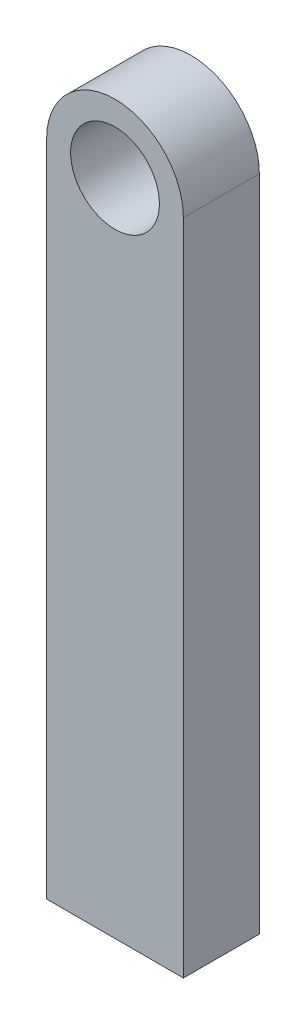
ISO-10303-21;
HEADER;
FILE_DESCRIPTION(('STEP AP214'),'2;1');
FILE_NAME('part.step','',(''),(''),'','','');
FILE_SCHEMA(('AUTOMOTIVE_DESIGN { 1 0 10303 214 1 1 1 1 }'));
ENDSEC;
DATA;
#1=APPLICATION_CONTEXT('core data for automotive mechanical design processes');
#2=APPLICATION_PROTOCOL_DEFINITION('international standard','automotive_design',2000,#1);
#3=PRODUCT_CONTEXT('',#1,'mechanical');
#4=PRODUCT('Part','Part','',(#3));
#5=PRODUCT_RELATED_PRODUCT_CATEGORY('part','',(#4));
#6=PRODUCT_DEFINITION_FORMATION('','',#4);
#7=PRODUCT_DEFINITION_CONTEXT('part definition',#1,'design');
#8=PRODUCT_DEFINITION('design','',#6,#7);
#9=PRODUCT_DEFINITION_SHAPE('','',#8);
#10=(LENGTH_UNIT() NAMED_UNIT(*) SI_UNIT(.MILLI.,.METRE.));
#11=(NAMED_UNIT(*) PLANE_ANGLE_UNIT() SI_UNIT($,.RADIAN.));
#12=(NAMED_UNIT(*) SI_UNIT($,.STERADIAN.) SOLID_ANGLE_UNIT());
#13=UNCERTAINTY_MEASURE_WITH_UNIT(LENGTH_MEASURE(1.E-05),#10,'distance_accuracy_value','');
#14=(GEOMETRIC_REPRESENTATION_CONTEXT(3) GLOBAL_UNCERTAINTY_ASSIGNED_CONTEXT((#13)) GLOBAL_UNIT_ASSIGNED_CONTEXT((#10,
#11,#12)) REPRESENTATION_CONTEXT('',''));
#15=CARTESIAN_POINT('',(0.,0.,0.));
#16=DIRECTION('',(0.,0.,1.));
#17=DIRECTION('',(1.,0.,0.));
#18=AXIS2_PLACEMENT_3D('',#15,#16,#17);
#19=CARTESIAN_POINT('',(27.,260.,30.));
#20=DIRECTION('',(0.,0.,1.));
#21=DIRECTION('',(1.,0.,0.));
#22=AXIS2_PLACEMENT_3D('',#19,#20,#21);
#23=PLANE('',#22);
#24=DIRECTION('',(0.,-1.,0.));
#25=VECTOR('',#24,1.);
#26=CARTESIAN_POINT('',(0.,0.,30.));
#27=LINE('',#26,#25);
#28=CARTESIAN_POINT('',(0.,260.,30.));
#29=VERTEX_POINT('',#28);
#30=CARTESIAN_POINT('',(0.,0.,30.));
#31=VERTEX_POINT('',#30);
#32=EDGE_CURVE('E98',#29,#31,#27,.T.);
#33=ORIENTED_EDGE('',*,*,#32,.T.);
#34=DIRECTION('',(1.,0.,0.));
#35=VECTOR('',#34,1.);
#36=CARTESIAN_POINT('',(0.,0.,30.));
#37=LINE('',#36,#35);
#38=CARTESIAN_POINT('',(54.,0.,30.));
#39=VERTEX_POINT('',#38);
#40=EDGE_CURVE('E93',#31,#39,#37,.T.);
#41=ORIENTED_EDGE('',*,*,#40,.T.);
#42=DIRECTION('',(0.,1.,0.));
#43=VECTOR('',#42,1.);
#44=CARTESIAN_POINT('',(54.,0.,30.));
#45=LINE('',#44,#43);
#46=CARTESIAN_POINT('',(54.,260.,30.));
#47=VERTEX_POINT('',#46);
#48=EDGE_CURVE('E96',#39,#47,#45,.T.);
#49=ORIENTED_EDGE('',*,*,#48,.T.);
#50=CARTESIAN_POINT('',(27.,260.,30.));
#51=DIRECTION('',(0.,0.,1.));
#52=DIRECTION('',(1.,0.,0.));
#53=AXIS2_PLACEMENT_3D('',#50,#51,#52);
#54=CIRCLE('',#53,27.);
#55=EDGE_CURVE('E63',#47,#29,#54,.T.);
#56=ORIENTED_EDGE('',*,*,#55,.T.);
#57=EDGE_LOOP('',(#33,#41,#49,#56));
#58=FACE_BOUND('',#57,.T.);
#59=CARTESIAN_POINT('',(27.,260.,30.));
#60=DIRECTION('',(0.,0.,1.));
#61=DIRECTION('',(1.,0.,0.));
#62=AXIS2_PLACEMENT_3D('',#59,#60,#61);
#63=CIRCLE('',#62,17.525);
#64=CARTESIAN_POINT('',(44.525,260.,30.));
#65=VERTEX_POINT('',#64);
#66=EDGE_CURVE('E118',#65,#65,#63,.T.);
#67=ORIENTED_EDGE('',*,*,#66,.F.);
#68=EDGE_LOOP('',(#67));
#69=FACE_BOUND('',#68,.T.);
#70=ADVANCED_FACE('F45',(#58,#69),#23,.T.);
#71=CARTESIAN_POINT('',(27.,260.,0.));
#72=DIRECTION('',(0.,0.,1.));
#73=DIRECTION('',(1.,0.,0.));
#74=AXIS2_PLACEMENT_3D('',#71,#72,#73);
#75=PLANE('',#74);
#76=DIRECTION('',(0.,-1.,0.));
#77=VECTOR('',#76,1.);
#78=CARTESIAN_POINT('',(0.,0.,0.));
#79=LINE('',#78,#77);
#80=CARTESIAN_POINT('',(0.,260.,0.));
#81=VERTEX_POINT('',#80);
#82=CARTESIAN_POINT('',(0.,0.,0.));
#83=VERTEX_POINT('',#82);
#84=EDGE_CURVE('E114',#81,#83,#79,.T.);
#85=ORIENTED_EDGE('',*,*,#84,.F.);
#86=CARTESIAN_POINT('',(27.,260.,0.));
#87=DIRECTION('',(0.,0.,1.));
#88=DIRECTION('',(1.,0.,0.));
#89=AXIS2_PLACEMENT_3D('',#86,#87,#88);
#90=CIRCLE('',#89,27.);
#91=CARTESIAN_POINT('',(54.,260.,0.));
#92=VERTEX_POINT('',#91);
#93=EDGE_CURVE('E86',#92,#81,#90,.T.);
#94=ORIENTED_EDGE('',*,*,#93,.F.);
#95=DIRECTION('',(0.,1.,0.));
#96=VECTOR('',#95,1.);
#97=CARTESIAN_POINT('',(54.,0.,0.));
#98=LINE('',#97,#96);
#99=CARTESIAN_POINT('',(54.,0.,0.));
#100=VERTEX_POINT('',#99);
#101=EDGE_CURVE('E80',#100,#92,#98,.T.);
#102=ORIENTED_EDGE('',*,*,#101,.F.);
#103=DIRECTION('',(1.,0.,0.));
#104=VECTOR('',#103,1.);
#105=CARTESIAN_POINT('',(0.,0.,0.));
#106=LINE('',#105,#104);
#107=EDGE_CURVE('E103',#83,#100,#106,.T.);
#108=ORIENTED_EDGE('',*,*,#107,.F.);
#109=EDGE_LOOP('',(#85,#94,#102,#108));
#110=FACE_BOUND('',#109,.T.);
#111=CARTESIAN_POINT('',(27.,260.,0.));
#112=DIRECTION('',(0.,0.,1.));
#113=DIRECTION('',(1.,0.,0.));
#114=AXIS2_PLACEMENT_3D('',#111,#112,#113);
#115=CIRCLE('',#114,17.525);
#116=CARTESIAN_POINT('',(44.525,260.,0.));
#117=VERTEX_POINT('',#116);
#118=EDGE_CURVE('E136',#117,#117,#115,.T.);
#119=ORIENTED_EDGE('',*,*,#118,.T.);
#120=EDGE_LOOP('',(#119));
#121=FACE_BOUND('',#120,.T.);
#122=ADVANCED_FACE('F131',(#110,#121),#75,.F.);
#123=CARTESIAN_POINT('',(0.,0.,30.));
#124=DIRECTION('',(1.,0.,0.));
#125=DIRECTION('',(0.,0.,-1.));
#126=AXIS2_PLACEMENT_3D('',#123,#124,#125);
#127=PLANE('',#126);
#128=ORIENTED_EDGE('',*,*,#84,.T.);
#129=DIRECTION('',(0.,0.,-1.));
#130=VECTOR('',#129,1.);
#131=CARTESIAN_POINT('',(0.,0.,30.));
#132=LINE('',#131,#130);
#133=EDGE_CURVE('E11',#31,#83,#132,.T.);
#134=ORIENTED_EDGE('',*,*,#133,.F.);
#135=ORIENTED_EDGE('',*,*,#32,.F.);
#136=DIRECTION('',(0.,0.,-1.));
#137=VECTOR('',#136,1.);
#138=CARTESIAN_POINT('',(0.,260.,30.));
#139=LINE('',#138,#137);
#140=EDGE_CURVE('E110',#29,#81,#139,.T.);
#141=ORIENTED_EDGE('',*,*,#140,.T.);
#142=EDGE_LOOP('',(#128,#134,#135,#141));
#143=FACE_BOUND('',#142,.T.);
#144=ADVANCED_FACE('F47',(#143),#127,.F.);
#145=CARTESIAN_POINT('',(0.,0.,30.));
#146=DIRECTION('',(0.,1.,0.));
#147=DIRECTION('',(0.,0.,1.));
#148=AXIS2_PLACEMENT_3D('',#145,#146,#147);
#149=PLANE('',#148);
#150=ORIENTED_EDGE('',*,*,#107,.T.);
#151=DIRECTION('',(0.,0.,-1.));
#152=VECTOR('',#151,1.);
#153=CARTESIAN_POINT('',(54.,0.,30.));
#154=LINE('',#153,#152);
#155=EDGE_CURVE('E55',#39,#100,#154,.T.);
#156=ORIENTED_EDGE('',*,*,#155,.F.);
#157=ORIENTED_EDGE('',*,*,#40,.F.);
#158=ORIENTED_EDGE('',*,*,#133,.T.);
#159=EDGE_LOOP('',(#150,#156,#157,#158));
#160=FACE_BOUND('',#159,.T.);
#161=ADVANCED_FACE('F102',(#160),#149,.F.);
#162=CARTESIAN_POINT('',(54.,0.,30.));
#163=DIRECTION('',(-1.,0.,0.));
#164=DIRECTION('',(0.,0.,1.));
#165=AXIS2_PLACEMENT_3D('',#162,#163,#164);
#166=PLANE('',#165);
#167=ORIENTED_EDGE('',*,*,#101,.T.);
#168=DIRECTION('',(0.,0.,-1.));
#169=VECTOR('',#168,1.);
#170=CARTESIAN_POINT('',(54.,260.,30.));
#171=LINE('',#170,#169);
#172=EDGE_CURVE('E105',#47,#92,#171,.T.);
#173=ORIENTED_EDGE('',*,*,#172,.F.);
#174=ORIENTED_EDGE('',*,*,#48,.F.);
#175=ORIENTED_EDGE('',*,*,#155,.T.);
#176=EDGE_LOOP('',(#167,#173,#174,#175));
#177=FACE_BOUND('',#176,.T.);
#178=ADVANCED_FACE('F106',(#177),#166,.F.);
#179=CARTESIAN_POINT('',(27.,260.,30.));
#180=DIRECTION('',(0.,0.,-1.));
#181=DIRECTION('',(-1.,0.,0.));
#182=AXIS2_PLACEMENT_3D('',#179,#180,#181);
#183=CYLINDRICAL_SURFACE('',#182,27.);
#184=ORIENTED_EDGE('',*,*,#93,.T.);
#185=ORIENTED_EDGE('',*,*,#140,.F.);
#186=ORIENTED_EDGE('',*,*,#55,.F.);
#187=ORIENTED_EDGE('',*,*,#172,.T.);
#188=EDGE_LOOP('',(#184,#185,#186,#187));
#189=FACE_BOUND('',#188,.T.);
#190=ADVANCED_FACE('F128',(#189),#183,.T.);
#191=CARTESIAN_POINT('',(27.,260.,30.));
#192=DIRECTION('',(0.,0.,-1.));
#193=DIRECTION('',(-1.,0.,0.));
#194=AXIS2_PLACEMENT_3D('',#191,#192,#193);
#195=CYLINDRICAL_SURFACE('',#194,17.525);
#196=ORIENTED_EDGE('',*,*,#66,.T.);
#197=EDGE_LOOP('',(#196));
#198=FACE_BOUND('',#197,.T.);
#199=ORIENTED_EDGE('',*,*,#118,.F.);
#200=EDGE_LOOP('',(#199));
#201=FACE_BOUND('',#200,.T.);
#202=ADVANCED_FACE('F144',(#198,#201),#195,.F.);
#203=CLOSED_SHELL('',(#70,#122,#144,#161,#178,#190,#202));
#204=MANIFOLD_SOLID_BREP('B2',#203);
#205=ADVANCED_BREP_SHAPE_REPRESENTATION('',(#18,#204),#14);
#206=SHAPE_DEFINITION_REPRESENTATION(#9,#205);
ENDSEC;
END-ISO-10303-21;
